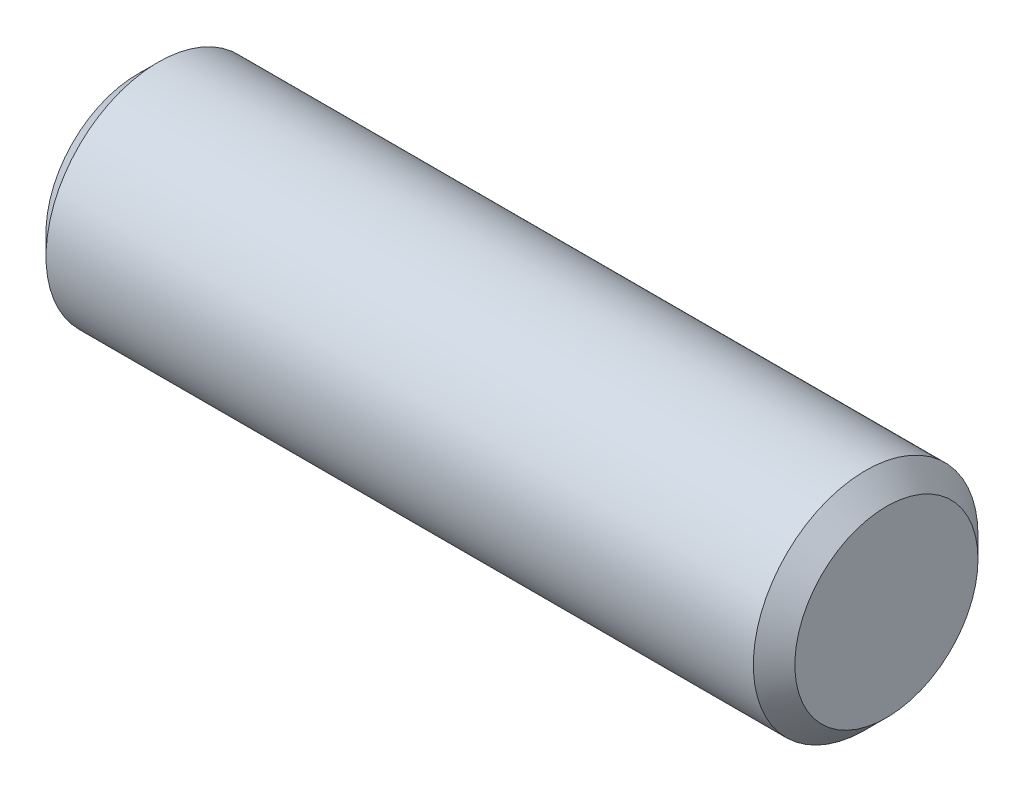
ISO-10303-21;
HEADER;
FILE_DESCRIPTION(('STEP AP214'),'2;1');
FILE_NAME('part.step','',(''),(''),'','','');
FILE_SCHEMA(('AUTOMOTIVE_DESIGN { 1 0 10303 214 1 1 1 1 }'));
ENDSEC;
DATA;
#1=APPLICATION_CONTEXT('core data for automotive mechanical design processes');
#2=APPLICATION_PROTOCOL_DEFINITION('international standard','automotive_design',2000,#1);
#3=PRODUCT_CONTEXT('',#1,'mechanical');
#4=PRODUCT('Part','Part','',(#3));
#5=PRODUCT_RELATED_PRODUCT_CATEGORY('part','',(#4));
#6=PRODUCT_DEFINITION_FORMATION('','',#4);
#7=PRODUCT_DEFINITION_CONTEXT('part definition',#1,'design');
#8=PRODUCT_DEFINITION('design','',#6,#7);
#9=PRODUCT_DEFINITION_SHAPE('','',#8);
#10=(LENGTH_UNIT() NAMED_UNIT(*) SI_UNIT(.MILLI.,.METRE.));
#11=(NAMED_UNIT(*) PLANE_ANGLE_UNIT() SI_UNIT($,.RADIAN.));
#12=(NAMED_UNIT(*) SI_UNIT($,.STERADIAN.) SOLID_ANGLE_UNIT());
#13=UNCERTAINTY_MEASURE_WITH_UNIT(LENGTH_MEASURE(1.E-05),#10,'distance_accuracy_value','');
#14=(GEOMETRIC_REPRESENTATION_CONTEXT(3) GLOBAL_UNCERTAINTY_ASSIGNED_CONTEXT((#13)) GLOBAL_UNIT_ASSIGNED_CONTEXT((#10,
#11,#12)) REPRESENTATION_CONTEXT('',''));
#15=CARTESIAN_POINT('',(0.,0.,0.));
#16=DIRECTION('',(0.,0.,1.));
#17=DIRECTION('',(1.,0.,0.));
#18=AXIS2_PLACEMENT_3D('',#15,#16,#17);
#19=CARTESIAN_POINT('',(0.,3.,0.));
#20=DIRECTION('',(1.,0.,0.));
#21=DIRECTION('',(0.,0.,-1.));
#22=AXIS2_PLACEMENT_3D('',#19,#20,#21);
#23=PLANE('',#22);
#24=CARTESIAN_POINT('',(0.,0.,0.));
#25=DIRECTION('',(1.,0.,0.));
#26=DIRECTION('',(0.,0.,-1.));
#27=AXIS2_PLACEMENT_3D('',#24,#25,#26);
#28=CIRCLE('',#27,2.4455);
#29=CARTESIAN_POINT('',(0.,0.,-2.4455));
#30=VERTEX_POINT('',#29);
#31=EDGE_CURVE('E49',#30,#30,#28,.F.);
#32=ORIENTED_EDGE('',*,*,#31,.T.);
#33=EDGE_LOOP('',(#32));
#34=FACE_BOUND('',#33,.T.);
#35=ADVANCED_FACE('F34',(#34),#23,.F.);
#36=CARTESIAN_POINT('',(20.,3.,0.));
#37=DIRECTION('',(1.,0.,0.));
#38=DIRECTION('',(0.,0.,-1.));
#39=AXIS2_PLACEMENT_3D('',#36,#37,#38);
#40=PLANE('',#39);
#41=CARTESIAN_POINT('',(20.,0.,0.));
#42=DIRECTION('',(1.,0.,0.));
#43=DIRECTION('',(0.,0.,-1.));
#44=AXIS2_PLACEMENT_3D('',#41,#42,#43);
#45=CIRCLE('',#44,2.44549999999999);
#46=CARTESIAN_POINT('',(20.,0.,-2.44549999999999));
#47=VERTEX_POINT('',#46);
#48=EDGE_CURVE('E10',#47,#47,#45,.T.);
#49=ORIENTED_EDGE('',*,*,#48,.T.);
#50=EDGE_LOOP('',(#49));
#51=FACE_BOUND('',#50,.T.);
#52=ADVANCED_FACE('F65',(#51),#40,.T.);
#53=CARTESIAN_POINT('',(-3.175,0.,0.));
#54=DIRECTION('',(-1.,0.,0.));
#55=DIRECTION('',(0.,0.,1.));
#56=AXIS2_PLACEMENT_3D('',#53,#54,#55);
#57=CYLINDRICAL_SURFACE('',#56,3.);
#58=CARTESIAN_POINT('',(0.554500000000003,0.,0.));
#59=DIRECTION('',(1.,0.,0.));
#60=DIRECTION('',(0.,0.,-1.));
#61=AXIS2_PLACEMENT_3D('',#58,#59,#60);
#62=CIRCLE('',#61,3.);
#63=CARTESIAN_POINT('',(0.554500000000003,0.,-3.));
#64=VERTEX_POINT('',#63);
#65=EDGE_CURVE('E41',#64,#64,#62,.T.);
#66=ORIENTED_EDGE('',*,*,#65,.T.);
#67=EDGE_LOOP('',(#66));
#68=FACE_BOUND('',#67,.T.);
#69=CARTESIAN_POINT('',(19.4455,0.,0.));
#70=DIRECTION('',(1.,0.,0.));
#71=DIRECTION('',(0.,0.,-1.));
#72=AXIS2_PLACEMENT_3D('',#69,#70,#71);
#73=CIRCLE('',#72,3.);
#74=CARTESIAN_POINT('',(19.4455,0.,-3.));
#75=VERTEX_POINT('',#74);
#76=EDGE_CURVE('E45',#75,#75,#73,.F.);
#77=ORIENTED_EDGE('',*,*,#76,.T.);
#78=EDGE_LOOP('',(#77));
#79=FACE_BOUND('',#78,.T.);
#80=ADVANCED_FACE('F58',(#68,#79),#57,.T.);
#81=CARTESIAN_POINT('',(0.,0.,0.));
#82=DIRECTION('',(1.,0.,0.));
#83=DIRECTION('',(0.,0.,-1.));
#84=AXIS2_PLACEMENT_3D('',#81,#82,#83);
#85=CONICAL_SURFACE('',#84,2.4455,0.785398163397447);
#86=ORIENTED_EDGE('',*,*,#65,.F.);
#87=EDGE_LOOP('',(#86));
#88=FACE_BOUND('',#87,.T.);
#89=ORIENTED_EDGE('',*,*,#31,.F.);
#90=EDGE_LOOP('',(#89));
#91=FACE_BOUND('',#90,.T.);
#92=ADVANCED_FACE('F56',(#88,#91),#85,.T.);
#93=CARTESIAN_POINT('',(19.4455,0.,0.));
#94=DIRECTION('',(-1.,0.,0.));
#95=DIRECTION('',(0.,0.,1.));
#96=AXIS2_PLACEMENT_3D('',#93,#94,#95);
#97=CONICAL_SURFACE('',#96,3.,0.785398163397456);
#98=ORIENTED_EDGE('',*,*,#48,.F.);
#99=EDGE_LOOP('',(#98));
#100=FACE_BOUND('',#99,.T.);
#101=ORIENTED_EDGE('',*,*,#76,.F.);
#102=EDGE_LOOP('',(#101));
#103=FACE_BOUND('',#102,.T.);
#104=ADVANCED_FACE('F36',(#100,#103),#97,.T.);
#105=CLOSED_SHELL('',(#35,#52,#80,#92,#104));
#106=MANIFOLD_SOLID_BREP('B2',#105);
#107=ADVANCED_BREP_SHAPE_REPRESENTATION('',(#18,#106),#14);
#108=SHAPE_DEFINITION_REPRESENTATION(#9,#107);
ENDSEC;
END-ISO-10303-21;
